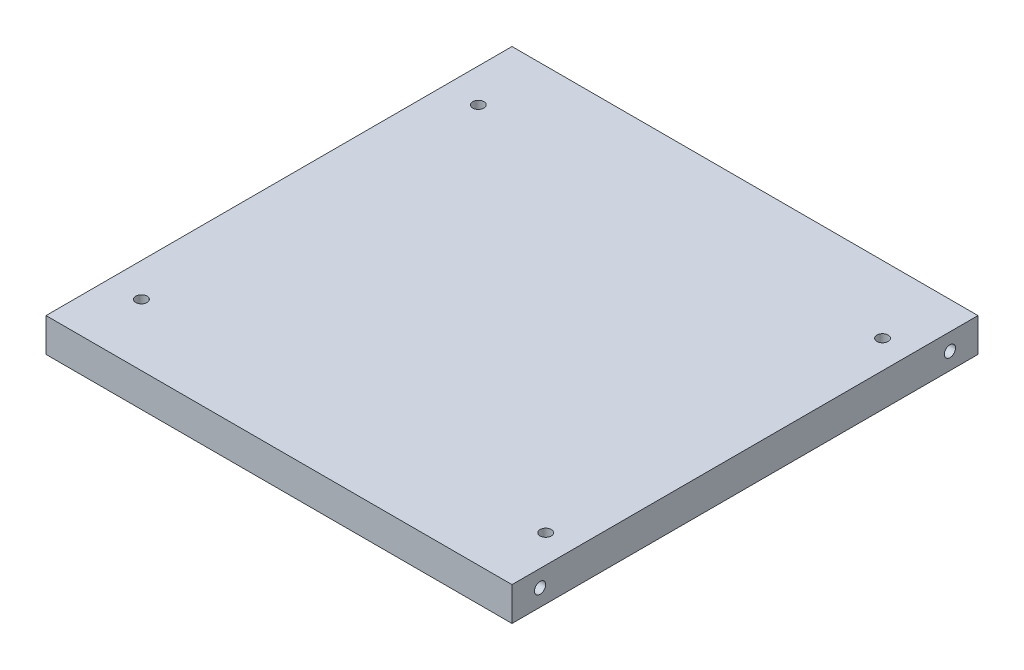
ISO-10303-21;
HEADER;
FILE_DESCRIPTION(('STEP AP214'),'2;1');
FILE_NAME('part.step','',(''),(''),'','','');
FILE_SCHEMA(('AUTOMOTIVE_DESIGN { 1 0 10303 214 1 1 1 1 }'));
ENDSEC;
DATA;
#1=APPLICATION_CONTEXT('core data for automotive mechanical design processes');
#2=APPLICATION_PROTOCOL_DEFINITION('international standard','automotive_design',2000,#1);
#3=PRODUCT_CONTEXT('',#1,'mechanical');
#4=PRODUCT('Part','Part','',(#3));
#5=PRODUCT_RELATED_PRODUCT_CATEGORY('part','',(#4));
#6=PRODUCT_DEFINITION_FORMATION('','',#4);
#7=PRODUCT_DEFINITION_CONTEXT('part definition',#1,'design');
#8=PRODUCT_DEFINITION('design','',#6,#7);
#9=PRODUCT_DEFINITION_SHAPE('','',#8);
#10=(LENGTH_UNIT() NAMED_UNIT(*) SI_UNIT(.MILLI.,.METRE.));
#11=(NAMED_UNIT(*) PLANE_ANGLE_UNIT() SI_UNIT($,.RADIAN.));
#12=(NAMED_UNIT(*) SI_UNIT($,.STERADIAN.) SOLID_ANGLE_UNIT());
#13=UNCERTAINTY_MEASURE_WITH_UNIT(LENGTH_MEASURE(1.E-05),#10,'distance_accuracy_value','');
#14=(GEOMETRIC_REPRESENTATION_CONTEXT(3) GLOBAL_UNCERTAINTY_ASSIGNED_CONTEXT((#13)) GLOBAL_UNIT_ASSIGNED_CONTEXT((#10,
#11,#12)) REPRESENTATION_CONTEXT('',''));
#15=CARTESIAN_POINT('',(0.,0.,0.));
#16=DIRECTION('',(0.,0.,1.));
#17=DIRECTION('',(1.,0.,0.));
#18=AXIS2_PLACEMENT_3D('',#15,#16,#17);
#19=CARTESIAN_POINT('',(78.,0.,-11.));
#20=DIRECTION('',(0.,1.,0.));
#21=DIRECTION('',(0.,0.,1.));
#22=AXIS2_PLACEMENT_3D('',#19,#20,#21);
#23=CYLINDRICAL_SURFACE('',#22,1.);
#24=CARTESIAN_POINT('',(78.,0.,-11.));
#25=DIRECTION('',(0.,1.,0.));
#26=DIRECTION('',(0.,0.,1.));
#27=AXIS2_PLACEMENT_3D('',#24,#25,#26);
#28=CIRCLE('',#27,1.);
#29=CARTESIAN_POINT('',(78.,0.,-10.));
#30=VERTEX_POINT('',#29);
#31=EDGE_CURVE('E42',#30,#30,#28,.T.);
#32=ORIENTED_EDGE('',*,*,#31,.F.);
#33=EDGE_LOOP('',(#32));
#34=FACE_BOUND('',#33,.T.);
#35=CARTESIAN_POINT('',(78.,6.,-11.));
#36=DIRECTION('',(0.,1.,0.));
#37=DIRECTION('',(0.,0.,1.));
#38=AXIS2_PLACEMENT_3D('',#35,#36,#37);
#39=CIRCLE('',#38,1.);
#40=CARTESIAN_POINT('',(78.,6.,-10.));
#41=VERTEX_POINT('',#40);
#42=EDGE_CURVE('E11',#41,#41,#39,.T.);
#43=ORIENTED_EDGE('',*,*,#42,.T.);
#44=EDGE_LOOP('',(#43));
#45=FACE_BOUND('',#44,.T.);
#46=ADVANCED_FACE('F34',(#34,#45),#23,.F.);
#47=CARTESIAN_POINT('',(6.00000000000001,0.,-11.));
#48=DIRECTION('',(0.,1.,0.));
#49=DIRECTION('',(0.,0.,1.));
#50=AXIS2_PLACEMENT_3D('',#47,#48,#49);
#51=CYLINDRICAL_SURFACE('',#50,1.);
#52=CARTESIAN_POINT('',(6.00000000000001,0.,-11.));
#53=DIRECTION('',(0.,1.,0.));
#54=DIRECTION('',(0.,0.,1.));
#55=AXIS2_PLACEMENT_3D('',#52,#53,#54);
#56=CIRCLE('',#55,1.);
#57=CARTESIAN_POINT('',(6.00000000000001,0.,-10.));
#58=VERTEX_POINT('',#57);
#59=EDGE_CURVE('E112',#58,#58,#56,.T.);
#60=ORIENTED_EDGE('',*,*,#59,.F.);
#61=EDGE_LOOP('',(#60));
#62=FACE_BOUND('',#61,.T.);
#63=CARTESIAN_POINT('',(6.00000000000001,6.,-11.));
#64=DIRECTION('',(0.,1.,0.));
#65=DIRECTION('',(0.,0.,1.));
#66=AXIS2_PLACEMENT_3D('',#63,#64,#65);
#67=CIRCLE('',#66,1.);
#68=CARTESIAN_POINT('',(6.00000000000001,6.,-10.));
#69=VERTEX_POINT('',#68);
#70=EDGE_CURVE('E115',#69,#69,#67,.T.);
#71=ORIENTED_EDGE('',*,*,#70,.T.);
#72=EDGE_LOOP('',(#71));
#73=FACE_BOUND('',#72,.T.);
#74=ADVANCED_FACE('F124',(#62,#73),#51,.F.);
#75=CARTESIAN_POINT('',(0.,6.,0.));
#76=DIRECTION('',(1.,0.,0.));
#77=DIRECTION('',(0.,0.,-1.));
#78=AXIS2_PLACEMENT_3D('',#75,#76,#77);
#79=PLANE('',#78);
#80=CARTESIAN_POINT('',(0.,3.,-78.));
#81=DIRECTION('',(-1.,0.,0.));
#82=DIRECTION('',(0.,0.,1.));
#83=AXIS2_PLACEMENT_3D('',#80,#81,#82);
#84=CIRCLE('',#83,0.999999999999998);
#85=CARTESIAN_POINT('',(0.,3.,-77.));
#86=VERTEX_POINT('',#85);
#87=EDGE_CURVE('E310',#86,#86,#84,.T.);
#88=ORIENTED_EDGE('',*,*,#87,.F.);
#89=EDGE_LOOP('',(#88));
#90=FACE_BOUND('',#89,.T.);
#91=CARTESIAN_POINT('',(0.,3.,-5.));
#92=DIRECTION('',(-1.,0.,0.));
#93=DIRECTION('',(0.,0.,1.));
#94=AXIS2_PLACEMENT_3D('',#91,#92,#93);
#95=CIRCLE('',#94,1.);
#96=CARTESIAN_POINT('',(0.,3.,-4.));
#97=VERTEX_POINT('',#96);
#98=EDGE_CURVE('E291',#97,#97,#95,.T.);
#99=ORIENTED_EDGE('',*,*,#98,.F.);
#100=EDGE_LOOP('',(#99));
#101=FACE_BOUND('',#100,.T.);
#102=DIRECTION('',(0.,0.,1.));
#103=VECTOR('',#102,1.);
#104=CARTESIAN_POINT('',(0.,0.,0.));
#105=LINE('',#104,#103);
#106=CARTESIAN_POINT('',(0.,0.,-83.));
#107=VERTEX_POINT('',#106);
#108=CARTESIAN_POINT('',(0.,0.,0.));
#109=VERTEX_POINT('',#108);
#110=EDGE_CURVE('E102',#107,#109,#105,.T.);
#111=ORIENTED_EDGE('',*,*,#110,.T.);
#112=DIRECTION('',(0.,-1.,0.));
#113=VECTOR('',#112,1.);
#114=CARTESIAN_POINT('',(0.,6.,0.));
#115=LINE('',#114,#113);
#116=CARTESIAN_POINT('',(0.,6.,0.));
#117=VERTEX_POINT('',#116);
#118=EDGE_CURVE('E93',#117,#109,#115,.T.);
#119=ORIENTED_EDGE('',*,*,#118,.F.);
#120=DIRECTION('',(0.,0.,1.));
#121=VECTOR('',#120,1.);
#122=CARTESIAN_POINT('',(0.,6.,0.));
#123=LINE('',#122,#121);
#124=CARTESIAN_POINT('',(0.,6.,-83.));
#125=VERTEX_POINT('',#124);
#126=EDGE_CURVE('E87',#125,#117,#123,.T.);
#127=ORIENTED_EDGE('',*,*,#126,.F.);
#128=DIRECTION('',(0.,-1.,0.));
#129=VECTOR('',#128,1.);
#130=CARTESIAN_POINT('',(0.,6.,-83.));
#131=LINE('',#130,#129);
#132=EDGE_CURVE('E98',#125,#107,#131,.T.);
#133=ORIENTED_EDGE('',*,*,#132,.T.);
#134=EDGE_LOOP('',(#111,#119,#127,#133));
#135=FACE_BOUND('',#134,.T.);
#136=ADVANCED_FACE('F149',(#90,#101,#135),#79,.F.);
#137=CARTESIAN_POINT('',(0.,6.,0.));
#138=DIRECTION('',(0.,0.,-1.));
#139=DIRECTION('',(-1.,0.,0.));
#140=AXIS2_PLACEMENT_3D('',#137,#138,#139);
#141=PLANE('',#140);
#142=DIRECTION('',(1.,0.,0.));
#143=VECTOR('',#142,1.);
#144=CARTESIAN_POINT('',(0.,0.,0.));
#145=LINE('',#144,#143);
#146=CARTESIAN_POINT('',(83.,0.,0.));
#147=VERTEX_POINT('',#146);
#148=EDGE_CURVE('E92',#109,#147,#145,.T.);
#149=ORIENTED_EDGE('',*,*,#148,.T.);
#150=DIRECTION('',(0.,-1.,0.));
#151=VECTOR('',#150,1.);
#152=CARTESIAN_POINT('',(83.,6.,0.));
#153=LINE('',#152,#151);
#154=CARTESIAN_POINT('',(83.,6.,0.));
#155=VERTEX_POINT('',#154);
#156=EDGE_CURVE('E90',#155,#147,#153,.T.);
#157=ORIENTED_EDGE('',*,*,#156,.F.);
#158=DIRECTION('',(1.,0.,0.));
#159=VECTOR('',#158,1.);
#160=CARTESIAN_POINT('',(0.,6.,0.));
#161=LINE('',#160,#159);
#162=EDGE_CURVE('E81',#117,#155,#161,.T.);
#163=ORIENTED_EDGE('',*,*,#162,.F.);
#164=ORIENTED_EDGE('',*,*,#118,.T.);
#165=EDGE_LOOP('',(#149,#157,#163,#164));
#166=FACE_BOUND('',#165,.T.);
#167=ADVANCED_FACE('F91',(#166),#141,.F.);
#168=CARTESIAN_POINT('',(83.,6.,0.));
#169=DIRECTION('',(-1.,0.,0.));
#170=DIRECTION('',(0.,0.,1.));
#171=AXIS2_PLACEMENT_3D('',#168,#169,#170);
#172=PLANE('',#171);
#173=CARTESIAN_POINT('',(83.,3.,-78.));
#174=DIRECTION('',(-1.,0.,0.));
#175=DIRECTION('',(0.,0.,1.));
#176=AXIS2_PLACEMENT_3D('',#173,#174,#175);
#177=CIRCLE('',#176,0.999999999999998);
#178=CARTESIAN_POINT('',(83.,3.,-77.));
#179=VERTEX_POINT('',#178);
#180=EDGE_CURVE('E292',#179,#179,#177,.T.);
#181=ORIENTED_EDGE('',*,*,#180,.T.);
#182=EDGE_LOOP('',(#181));
#183=FACE_BOUND('',#182,.T.);
#184=CARTESIAN_POINT('',(83.,3.,-5.));
#185=DIRECTION('',(-1.,0.,0.));
#186=DIRECTION('',(0.,0.,1.));
#187=AXIS2_PLACEMENT_3D('',#184,#185,#186);
#188=CIRCLE('',#187,1.);
#189=CARTESIAN_POINT('',(83.,3.,-4.));
#190=VERTEX_POINT('',#189);
#191=EDGE_CURVE('E303',#190,#190,#188,.T.);
#192=ORIENTED_EDGE('',*,*,#191,.T.);
#193=EDGE_LOOP('',(#192));
#194=FACE_BOUND('',#193,.T.);
#195=DIRECTION('',(0.,0.,-1.));
#196=VECTOR('',#195,1.);
#197=CARTESIAN_POINT('',(83.,0.,0.));
#198=LINE('',#197,#196);
#199=CARTESIAN_POINT('',(83.,0.,-83.));
#200=VERTEX_POINT('',#199);
#201=EDGE_CURVE('E67',#147,#200,#198,.T.);
#202=ORIENTED_EDGE('',*,*,#201,.T.);
#203=DIRECTION('',(0.,-1.,0.));
#204=VECTOR('',#203,1.);
#205=CARTESIAN_POINT('',(83.,6.,-83.));
#206=LINE('',#205,#204);
#207=CARTESIAN_POINT('',(83.,6.,-83.));
#208=VERTEX_POINT('',#207);
#209=EDGE_CURVE('E94',#208,#200,#206,.T.);
#210=ORIENTED_EDGE('',*,*,#209,.F.);
#211=DIRECTION('',(0.,0.,-1.));
#212=VECTOR('',#211,1.);
#213=CARTESIAN_POINT('',(83.,6.,0.));
#214=LINE('',#213,#212);
#215=EDGE_CURVE('E85',#155,#208,#214,.T.);
#216=ORIENTED_EDGE('',*,*,#215,.F.);
#217=ORIENTED_EDGE('',*,*,#156,.T.);
#218=EDGE_LOOP('',(#202,#210,#216,#217));
#219=FACE_BOUND('',#218,.T.);
#220=ADVANCED_FACE('F96',(#183,#194,#219),#172,.F.);
#221=CARTESIAN_POINT('',(0.,6.,-83.));
#222=DIRECTION('',(0.,0.,1.));
#223=DIRECTION('',(1.,0.,0.));
#224=AXIS2_PLACEMENT_3D('',#221,#222,#223);
#225=PLANE('',#224);
#226=DIRECTION('',(-1.,0.,0.));
#227=VECTOR('',#226,1.);
#228=CARTESIAN_POINT('',(0.,0.,-83.));
#229=LINE('',#228,#227);
#230=EDGE_CURVE('E73',#200,#107,#229,.T.);
#231=ORIENTED_EDGE('',*,*,#230,.T.);
#232=ORIENTED_EDGE('',*,*,#132,.F.);
#233=DIRECTION('',(-1.,0.,0.));
#234=VECTOR('',#233,1.);
#235=CARTESIAN_POINT('',(0.,6.,-83.));
#236=LINE('',#235,#234);
#237=EDGE_CURVE('E50',#208,#125,#236,.T.);
#238=ORIENTED_EDGE('',*,*,#237,.F.);
#239=ORIENTED_EDGE('',*,*,#209,.T.);
#240=EDGE_LOOP('',(#231,#232,#238,#239));
#241=FACE_BOUND('',#240,.T.);
#242=ADVANCED_FACE('F128',(#241),#225,.F.);
#243=CARTESIAN_POINT('',(0.,6.,0.));
#244=DIRECTION('',(0.,-1.,0.));
#245=DIRECTION('',(0.,0.,-1.));
#246=AXIS2_PLACEMENT_3D('',#243,#244,#245);
#247=PLANE('',#246);
#248=CARTESIAN_POINT('',(78.,6.,-71.));
#249=DIRECTION('',(0.,1.,0.));
#250=DIRECTION('',(0.,0.,1.));
#251=AXIS2_PLACEMENT_3D('',#248,#249,#250);
#252=CIRCLE('',#251,1.);
#253=CARTESIAN_POINT('',(78.,6.,-70.));
#254=VERTEX_POINT('',#253);
#255=EDGE_CURVE('E317',#254,#254,#252,.T.);
#256=ORIENTED_EDGE('',*,*,#255,.F.);
#257=EDGE_LOOP('',(#256));
#258=FACE_BOUND('',#257,.T.);
#259=CARTESIAN_POINT('',(6.,6.,-71.));
#260=DIRECTION('',(0.,1.,0.));
#261=DIRECTION('',(0.,0.,1.));
#262=AXIS2_PLACEMENT_3D('',#259,#260,#261);
#263=CIRCLE('',#262,1.);
#264=CARTESIAN_POINT('',(6.,6.,-70.));
#265=VERTEX_POINT('',#264);
#266=EDGE_CURVE('E320',#265,#265,#263,.T.);
#267=ORIENTED_EDGE('',*,*,#266,.F.);
#268=EDGE_LOOP('',(#267));
#269=FACE_BOUND('',#268,.T.);
#270=ORIENTED_EDGE('',*,*,#126,.T.);
#271=ORIENTED_EDGE('',*,*,#162,.T.);
#272=ORIENTED_EDGE('',*,*,#215,.T.);
#273=ORIENTED_EDGE('',*,*,#237,.T.);
#274=EDGE_LOOP('',(#270,#271,#272,#273));
#275=FACE_BOUND('',#274,.T.);
#276=ORIENTED_EDGE('',*,*,#70,.F.);
#277=EDGE_LOOP('',(#276));
#278=FACE_BOUND('',#277,.T.);
#279=ORIENTED_EDGE('',*,*,#42,.F.);
#280=EDGE_LOOP('',(#279));
#281=FACE_BOUND('',#280,.T.);
#282=ADVANCED_FACE('F82',(#258,#269,#275,#278,#281),#247,.F.);
#283=CARTESIAN_POINT('',(0.,0.,0.));
#284=DIRECTION('',(0.,-1.,0.));
#285=DIRECTION('',(0.,0.,-1.));
#286=AXIS2_PLACEMENT_3D('',#283,#284,#285);
#287=PLANE('',#286);
#288=CARTESIAN_POINT('',(78.,0.,-71.));
#289=DIRECTION('',(0.,1.,0.));
#290=DIRECTION('',(0.,0.,1.));
#291=AXIS2_PLACEMENT_3D('',#288,#289,#290);
#292=CIRCLE('',#291,1.);
#293=CARTESIAN_POINT('',(78.,0.,-70.));
#294=VERTEX_POINT('',#293);
#295=EDGE_CURVE('E309',#294,#294,#292,.T.);
#296=ORIENTED_EDGE('',*,*,#295,.T.);
#297=EDGE_LOOP('',(#296));
#298=FACE_BOUND('',#297,.T.);
#299=CARTESIAN_POINT('',(6.,0.,-71.));
#300=DIRECTION('',(0.,1.,0.));
#301=DIRECTION('',(0.,0.,1.));
#302=AXIS2_PLACEMENT_3D('',#299,#300,#301);
#303=CIRCLE('',#302,1.);
#304=CARTESIAN_POINT('',(6.,0.,-70.));
#305=VERTEX_POINT('',#304);
#306=EDGE_CURVE('E105',#305,#305,#303,.T.);
#307=ORIENTED_EDGE('',*,*,#306,.T.);
#308=EDGE_LOOP('',(#307));
#309=FACE_BOUND('',#308,.T.);
#310=ORIENTED_EDGE('',*,*,#110,.F.);
#311=ORIENTED_EDGE('',*,*,#230,.F.);
#312=ORIENTED_EDGE('',*,*,#201,.F.);
#313=ORIENTED_EDGE('',*,*,#148,.F.);
#314=EDGE_LOOP('',(#310,#311,#312,#313));
#315=FACE_BOUND('',#314,.T.);
#316=ORIENTED_EDGE('',*,*,#59,.T.);
#317=EDGE_LOOP('',(#316));
#318=FACE_BOUND('',#317,.T.);
#319=ORIENTED_EDGE('',*,*,#31,.T.);
#320=EDGE_LOOP('',(#319));
#321=FACE_BOUND('',#320,.T.);
#322=ADVANCED_FACE('F120',(#298,#309,#315,#318,#321),#287,.T.);
#323=CARTESIAN_POINT('',(6.,0.,-71.));
#324=DIRECTION('',(0.,1.,0.));
#325=DIRECTION('',(0.,0.,1.));
#326=AXIS2_PLACEMENT_3D('',#323,#324,#325);
#327=CYLINDRICAL_SURFACE('',#326,1.);
#328=ORIENTED_EDGE('',*,*,#306,.F.);
#329=EDGE_LOOP('',(#328));
#330=FACE_BOUND('',#329,.T.);
#331=ORIENTED_EDGE('',*,*,#266,.T.);
#332=EDGE_LOOP('',(#331));
#333=FACE_BOUND('',#332,.T.);
#334=ADVANCED_FACE('F135',(#330,#333),#327,.F.);
#335=CARTESIAN_POINT('',(78.,0.,-71.));
#336=DIRECTION('',(0.,1.,0.));
#337=DIRECTION('',(0.,0.,1.));
#338=AXIS2_PLACEMENT_3D('',#335,#336,#337);
#339=CYLINDRICAL_SURFACE('',#338,1.);
#340=ORIENTED_EDGE('',*,*,#295,.F.);
#341=EDGE_LOOP('',(#340));
#342=FACE_BOUND('',#341,.T.);
#343=ORIENTED_EDGE('',*,*,#255,.T.);
#344=EDGE_LOOP('',(#343));
#345=FACE_BOUND('',#344,.T.);
#346=ADVANCED_FACE('F191',(#342,#345),#339,.F.);
#347=CARTESIAN_POINT('',(10.,3.,-5.));
#348=DIRECTION('',(-1.,0.,0.));
#349=DIRECTION('',(0.,0.,1.));
#350=AXIS2_PLACEMENT_3D('',#347,#348,#349);
#351=CYLINDRICAL_SURFACE('',#350,1.);
#352=CARTESIAN_POINT('',(10.,3.,-5.));
#353=DIRECTION('',(-1.,0.,0.));
#354=DIRECTION('',(0.,0.,1.));
#355=AXIS2_PLACEMENT_3D('',#352,#353,#354);
#356=CIRCLE('',#355,1.);
#357=CARTESIAN_POINT('',(10.,3.,-4.));
#358=VERTEX_POINT('',#357);
#359=EDGE_CURVE('E295',#358,#358,#356,.T.);
#360=ORIENTED_EDGE('',*,*,#359,.F.);
#361=EDGE_LOOP('',(#360));
#362=FACE_BOUND('',#361,.T.);
#363=ORIENTED_EDGE('',*,*,#98,.T.);
#364=EDGE_LOOP('',(#363));
#365=FACE_BOUND('',#364,.T.);
#366=ADVANCED_FACE('F208',(#362,#365),#351,.F.);
#367=CARTESIAN_POINT('',(10.,3.,-5.));
#368=DIRECTION('',(-1.,0.,0.));
#369=DIRECTION('',(0.,0.,1.));
#370=AXIS2_PLACEMENT_3D('',#367,#368,#369);
#371=PLANE('',#370);
#372=ORIENTED_EDGE('',*,*,#359,.T.);
#373=EDGE_LOOP('',(#372));
#374=FACE_BOUND('',#373,.T.);
#375=ADVANCED_FACE('F216',(#374),#371,.T.);
#376=CARTESIAN_POINT('',(10.,3.,-78.));
#377=DIRECTION('',(-1.,0.,0.));
#378=DIRECTION('',(0.,0.,1.));
#379=AXIS2_PLACEMENT_3D('',#376,#377,#378);
#380=CYLINDRICAL_SURFACE('',#379,0.999999999999998);
#381=CARTESIAN_POINT('',(10.,3.,-78.));
#382=DIRECTION('',(-1.,0.,0.));
#383=DIRECTION('',(0.,0.,1.));
#384=AXIS2_PLACEMENT_3D('',#381,#382,#383);
#385=CIRCLE('',#384,0.999999999999998);
#386=CARTESIAN_POINT('',(10.,3.,-77.));
#387=VERTEX_POINT('',#386);
#388=EDGE_CURVE('E306',#387,#387,#385,.T.);
#389=ORIENTED_EDGE('',*,*,#388,.F.);
#390=EDGE_LOOP('',(#389));
#391=FACE_BOUND('',#390,.T.);
#392=ORIENTED_EDGE('',*,*,#87,.T.);
#393=EDGE_LOOP('',(#392));
#394=FACE_BOUND('',#393,.T.);
#395=ADVANCED_FACE('F225',(#391,#394),#380,.F.);
#396=CARTESIAN_POINT('',(10.,3.,-78.));
#397=DIRECTION('',(-1.,0.,0.));
#398=DIRECTION('',(0.,0.,1.));
#399=AXIS2_PLACEMENT_3D('',#396,#397,#398);
#400=PLANE('',#399);
#401=ORIENTED_EDGE('',*,*,#388,.T.);
#402=EDGE_LOOP('',(#401));
#403=FACE_BOUND('',#402,.T.);
#404=ADVANCED_FACE('F234',(#403),#400,.T.);
#405=CARTESIAN_POINT('',(73.,3.,-5.));
#406=DIRECTION('',(1.,0.,0.));
#407=DIRECTION('',(0.,0.,-1.));
#408=AXIS2_PLACEMENT_3D('',#405,#406,#407);
#409=CYLINDRICAL_SURFACE('',#408,1.);
#410=CARTESIAN_POINT('',(73.,3.,-5.));
#411=DIRECTION('',(-1.,0.,0.));
#412=DIRECTION('',(0.,0.,1.));
#413=AXIS2_PLACEMENT_3D('',#410,#411,#412);
#414=CIRCLE('',#413,1.);
#415=CARTESIAN_POINT('',(73.,3.,-4.));
#416=VERTEX_POINT('',#415);
#417=EDGE_CURVE('E298',#416,#416,#414,.T.);
#418=ORIENTED_EDGE('',*,*,#417,.T.);
#419=EDGE_LOOP('',(#418));
#420=FACE_BOUND('',#419,.T.);
#421=ORIENTED_EDGE('',*,*,#191,.F.);
#422=EDGE_LOOP('',(#421));
#423=FACE_BOUND('',#422,.T.);
#424=ADVANCED_FACE('F242',(#420,#423),#409,.F.);
#425=CARTESIAN_POINT('',(73.,3.,-5.));
#426=DIRECTION('',(1.,0.,0.));
#427=DIRECTION('',(0.,0.,1.));
#428=AXIS2_PLACEMENT_3D('',#425,#426,#427);
#429=PLANE('',#428);
#430=ORIENTED_EDGE('',*,*,#417,.F.);
#431=EDGE_LOOP('',(#430));
#432=FACE_BOUND('',#431,.T.);
#433=ADVANCED_FACE('F250',(#432),#429,.T.);
#434=CARTESIAN_POINT('',(73.,3.,-78.));
#435=DIRECTION('',(1.,0.,0.));
#436=DIRECTION('',(0.,0.,-1.));
#437=AXIS2_PLACEMENT_3D('',#434,#435,#436);
#438=CYLINDRICAL_SURFACE('',#437,0.999999999999998);
#439=CARTESIAN_POINT('',(73.,3.,-78.));
#440=DIRECTION('',(-1.,0.,0.));
#441=DIRECTION('',(0.,0.,1.));
#442=AXIS2_PLACEMENT_3D('',#439,#440,#441);
#443=CIRCLE('',#442,0.999999999999998);
#444=CARTESIAN_POINT('',(73.,3.,-77.));
#445=VERTEX_POINT('',#444);
#446=EDGE_CURVE('E290',#445,#445,#443,.T.);
#447=ORIENTED_EDGE('',*,*,#446,.T.);
#448=EDGE_LOOP('',(#447));
#449=FACE_BOUND('',#448,.T.);
#450=ORIENTED_EDGE('',*,*,#180,.F.);
#451=EDGE_LOOP('',(#450));
#452=FACE_BOUND('',#451,.T.);
#453=ADVANCED_FACE('F259',(#449,#452),#438,.F.);
#454=CARTESIAN_POINT('',(73.,3.,-78.));
#455=DIRECTION('',(1.,0.,0.));
#456=DIRECTION('',(0.,0.,1.));
#457=AXIS2_PLACEMENT_3D('',#454,#455,#456);
#458=PLANE('',#457);
#459=ORIENTED_EDGE('',*,*,#446,.F.);
#460=EDGE_LOOP('',(#459));
#461=FACE_BOUND('',#460,.T.);
#462=ADVANCED_FACE('F268',(#461),#458,.T.);
#463=CLOSED_SHELL('',(#46,#74,#136,#167,#220,#242,#282,#322,#334,#346,#366,#375,#395,#404,#424,
#433,#453,#462));
#464=MANIFOLD_SOLID_BREP('B2',#463);
#465=ADVANCED_BREP_SHAPE_REPRESENTATION('',(#18,#464),#14);
#466=SHAPE_DEFINITION_REPRESENTATION(#9,#465);
ENDSEC;
END-ISO-10303-21;
